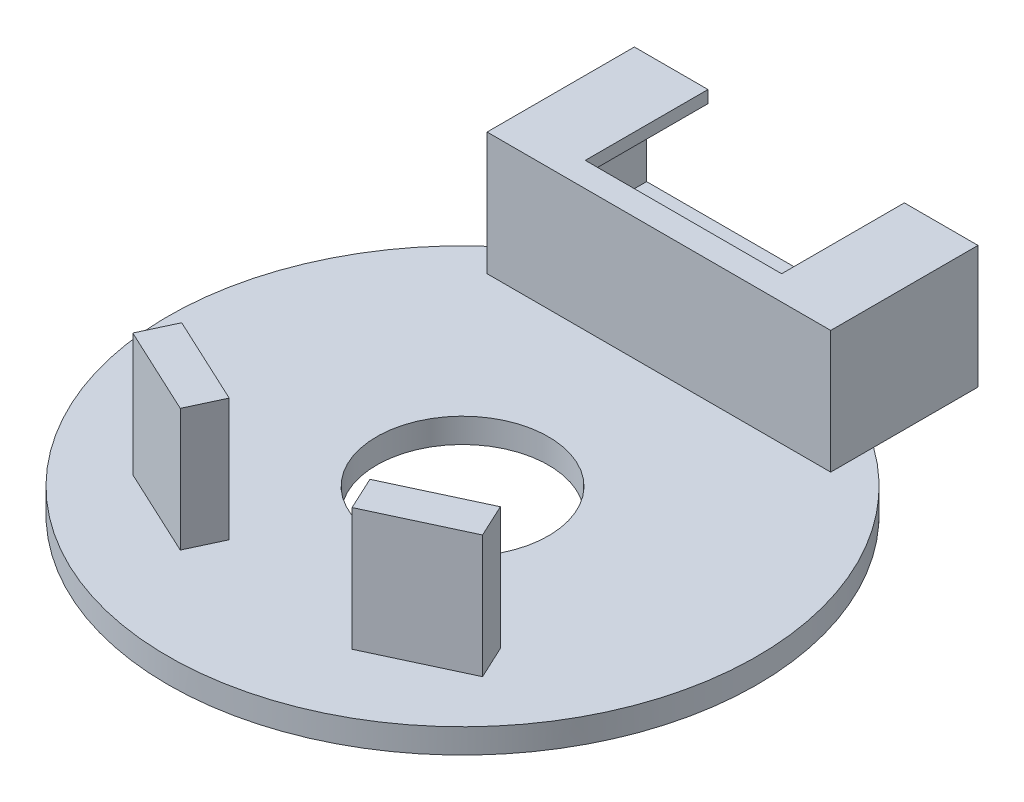
ISO-10303-21;
HEADER;
FILE_DESCRIPTION(('STEP AP214'),'2;1');
FILE_NAME('part.step','',(''),(''),'','','');
FILE_SCHEMA(('AUTOMOTIVE_DESIGN { 1 0 10303 214 1 1 1 1 }'));
ENDSEC;
DATA;
#1=APPLICATION_CONTEXT('core data for automotive mechanical design processes');
#2=APPLICATION_PROTOCOL_DEFINITION('international standard','automotive_design',2000,#1);
#3=PRODUCT_CONTEXT('',#1,'mechanical');
#4=PRODUCT('Part','Part','',(#3));
#5=PRODUCT_RELATED_PRODUCT_CATEGORY('part','',(#4));
#6=PRODUCT_DEFINITION_FORMATION('','',#4);
#7=PRODUCT_DEFINITION_CONTEXT('part definition',#1,'design');
#8=PRODUCT_DEFINITION('design','',#6,#7);
#9=PRODUCT_DEFINITION_SHAPE('','',#8);
#10=(LENGTH_UNIT() NAMED_UNIT(*) SI_UNIT(.MILLI.,.METRE.));
#11=(NAMED_UNIT(*) PLANE_ANGLE_UNIT() SI_UNIT($,.RADIAN.));
#12=(NAMED_UNIT(*) SI_UNIT($,.STERADIAN.) SOLID_ANGLE_UNIT());
#13=UNCERTAINTY_MEASURE_WITH_UNIT(LENGTH_MEASURE(1.E-05),#10,'distance_accuracy_value','');
#14=(GEOMETRIC_REPRESENTATION_CONTEXT(3) GLOBAL_UNCERTAINTY_ASSIGNED_CONTEXT((#13)) GLOBAL_UNIT_ASSIGNED_CONTEXT((#10,
#11,#12)) REPRESENTATION_CONTEXT('',''));
#15=CARTESIAN_POINT('',(0.,0.,0.));
#16=DIRECTION('',(0.,0.,1.));
#17=DIRECTION('',(1.,0.,0.));
#18=AXIS2_PLACEMENT_3D('',#15,#16,#17);
#19=CARTESIAN_POINT('',(0.,0.5,0.));
#20=DIRECTION('',(0.,1.,0.));
#21=DIRECTION('',(0.,0.,1.));
#22=AXIS2_PLACEMENT_3D('',#19,#20,#21);
#23=PLANE('',#22);
#24=DIRECTION('',(0.,0.,1.));
#25=VECTOR('',#24,1.);
#26=CARTESIAN_POINT('',(-7.,0.5,-14.));
#27=LINE('',#26,#25);
#28=CARTESIAN_POINT('',(-7.,0.5,-9.74679434480897));
#29=VERTEX_POINT('',#28);
#30=CARTESIAN_POINT('',(-7.,0.5,-8.));
#31=VERTEX_POINT('',#30);
#32=EDGE_CURVE('E12',#29,#31,#27,.T.);
#33=ORIENTED_EDGE('',*,*,#32,.F.);
#34=CARTESIAN_POINT('',(0.,0.5,0.));
#35=DIRECTION('',(0.,1.,0.));
#36=DIRECTION('',(0.,0.,1.));
#37=AXIS2_PLACEMENT_3D('',#34,#35,#36);
#38=CIRCLE('',#37,12.);
#39=CARTESIAN_POINT('',(7.,0.5,-9.74679434480897));
#40=VERTEX_POINT('',#39);
#41=EDGE_CURVE('E344',#29,#40,#38,.T.);
#42=ORIENTED_EDGE('',*,*,#41,.T.);
#43=DIRECTION('',(0.,0.,-1.));
#44=VECTOR('',#43,1.);
#45=CARTESIAN_POINT('',(7.,0.5,-14.));
#46=LINE('',#45,#44);
#47=CARTESIAN_POINT('',(7.,0.5,-8.));
#48=VERTEX_POINT('',#47);
#49=EDGE_CURVE('E323',#48,#40,#46,.T.);
#50=ORIENTED_EDGE('',*,*,#49,.F.);
#51=DIRECTION('',(1.,0.,0.));
#52=VECTOR('',#51,1.);
#53=CARTESIAN_POINT('',(-7.,0.5,-8.));
#54=LINE('',#53,#52);
#55=EDGE_CURVE('E319',#31,#48,#54,.T.);
#56=ORIENTED_EDGE('',*,*,#55,.F.);
#57=EDGE_LOOP('',(#33,#42,#50,#56));
#58=FACE_BOUND('',#57,.T.);
#59=CARTESIAN_POINT('',(0.,0.5,0.));
#60=DIRECTION('',(0.,1.,0.));
#61=DIRECTION('',(0.,0.,1.));
#62=AXIS2_PLACEMENT_3D('',#59,#60,#61);
#63=CIRCLE('',#62,3.5);
#64=CARTESIAN_POINT('',(0.,0.5,3.5));
#65=VERTEX_POINT('',#64);
#66=EDGE_CURVE('E339',#65,#65,#63,.T.);
#67=ORIENTED_EDGE('',*,*,#66,.F.);
#68=EDGE_LOOP('',(#67));
#69=FACE_BOUND('',#68,.T.);
#70=DIRECTION('',(0.906307787036653,0.,0.422618261740693));
#71=VECTOR('',#70,1.);
#72=CARTESIAN_POINT('',(-3.5,0.5,8.));
#73=LINE('',#72,#71);
#74=CARTESIAN_POINT('',(-7.12523114814661,0.5,6.30952695303723));
#75=VERTEX_POINT('',#74);
#76=CARTESIAN_POINT('',(-3.5,0.5,8.));
#77=VERTEX_POINT('',#76);
#78=EDGE_CURVE('E230',#75,#77,#73,.T.);
#79=ORIENTED_EDGE('',*,*,#78,.F.);
#80=DIRECTION('',(-0.422618261740693,0.,0.906307787036653));
#81=VECTOR('',#80,1.);
#82=CARTESIAN_POINT('',(-7.12523114814661,0.5,6.30952695303723));
#83=LINE('',#82,#81);
#84=CARTESIAN_POINT('',(-6.49130375553557,0.5,4.95006527248225));
#85=VERTEX_POINT('',#84);
#86=EDGE_CURVE('E209',#85,#75,#83,.T.);
#87=ORIENTED_EDGE('',*,*,#86,.F.);
#88=DIRECTION('',(-0.906307787036653,0.,-0.422618261740693));
#89=VECTOR('',#88,1.);
#90=CARTESIAN_POINT('',(-6.49130375553557,0.5,4.95006527248225));
#91=LINE('',#90,#89);
#92=CARTESIAN_POINT('',(-2.86607260738896,0.5,6.64053831944502));
#93=VERTEX_POINT('',#92);
#94=EDGE_CURVE('E223',#93,#85,#91,.T.);
#95=ORIENTED_EDGE('',*,*,#94,.F.);
#96=DIRECTION('',(0.422618261740693,0.,-0.906307787036653));
#97=VECTOR('',#96,1.);
#98=CARTESIAN_POINT('',(-2.86607260738896,0.5,6.64053831944502));
#99=LINE('',#98,#97);
#100=EDGE_CURVE('E67',#77,#93,#99,.T.);
#101=ORIENTED_EDGE('',*,*,#100,.F.);
#102=EDGE_LOOP('',(#79,#87,#95,#101));
#103=FACE_BOUND('',#102,.T.);
#104=DIRECTION('',(-0.422618261740693,0.,-0.906307787036653));
#105=VECTOR('',#104,1.);
#106=CARTESIAN_POINT('',(7.12523114814661,0.5,6.30952695303723));
#107=LINE('',#106,#105);
#108=CARTESIAN_POINT('',(7.12523114814661,0.5,6.30952695303723));
#109=VERTEX_POINT('',#108);
#110=CARTESIAN_POINT('',(6.49130375553557,0.5,4.95006527248225));
#111=VERTEX_POINT('',#110);
#112=EDGE_CURVE('E219',#109,#111,#107,.T.);
#113=ORIENTED_EDGE('',*,*,#112,.F.);
#114=DIRECTION('',(0.906307787036653,0.,-0.422618261740693));
#115=VECTOR('',#114,1.);
#116=CARTESIAN_POINT('',(3.5,0.5,8.));
#117=LINE('',#116,#115);
#118=CARTESIAN_POINT('',(3.5,0.5,8.));
#119=VERTEX_POINT('',#118);
#120=EDGE_CURVE('E213',#119,#109,#117,.T.);
#121=ORIENTED_EDGE('',*,*,#120,.F.);
#122=DIRECTION('',(0.422618261740693,0.,0.906307787036653));
#123=VECTOR('',#122,1.);
#124=CARTESIAN_POINT('',(2.86607260738896,0.5,6.64053831944502));
#125=LINE('',#124,#123);
#126=CARTESIAN_POINT('',(2.86607260738896,0.5,6.64053831944502));
#127=VERTEX_POINT('',#126);
#128=EDGE_CURVE('E193',#127,#119,#125,.T.);
#129=ORIENTED_EDGE('',*,*,#128,.F.);
#130=DIRECTION('',(-0.906307787036653,0.,0.422618261740693));
#131=VECTOR('',#130,1.);
#132=CARTESIAN_POINT('',(6.49130375553557,0.5,4.95006527248225));
#133=LINE('',#132,#131);
#134=EDGE_CURVE('E59',#111,#127,#133,.T.);
#135=ORIENTED_EDGE('',*,*,#134,.F.);
#136=EDGE_LOOP('',(#113,#121,#129,#135));
#137=FACE_BOUND('',#136,.T.);
#138=ADVANCED_FACE('F41',(#58,#69,#103,#137),#23,.T.);
#139=CARTESIAN_POINT('',(6.5,5.,5.60147050873545));
#140=DIRECTION('',(0.,1.,0.));
#141=DIRECTION('',(0.,0.,1.));
#142=AXIS2_PLACEMENT_3D('',#139,#140,#141);
#143=PLANE('',#142);
#144=DIRECTION('',(-1.,0.,0.));
#145=VECTOR('',#144,1.);
#146=CARTESIAN_POINT('',(6.5,5.,-9.));
#147=LINE('',#146,#145);
#148=CARTESIAN_POINT('',(6.5,5.,-9.));
#149=VERTEX_POINT('',#148);
#150=CARTESIAN_POINT('',(4.,5.,-9.));
#151=VERTEX_POINT('',#150);
#152=EDGE_CURVE('E278',#149,#151,#147,.T.);
#153=ORIENTED_EDGE('',*,*,#152,.T.);
#154=DIRECTION('',(0.,0.,-1.));
#155=VECTOR('',#154,1.);
#156=CARTESIAN_POINT('',(4.,5.,5.60147050873545));
#157=LINE('',#156,#155);
#158=CARTESIAN_POINT('',(4.,5.,-14.));
#159=VERTEX_POINT('',#158);
#160=EDGE_CURVE('E270',#151,#159,#157,.T.);
#161=ORIENTED_EDGE('',*,*,#160,.T.);
#162=DIRECTION('',(1.,0.,0.));
#163=VECTOR('',#162,1.);
#164=CARTESIAN_POINT('',(6.5,5.,-14.));
#165=LINE('',#164,#163);
#166=CARTESIAN_POINT('',(6.5,5.,-14.));
#167=VERTEX_POINT('',#166);
#168=EDGE_CURVE('E290',#159,#167,#165,.T.);
#169=ORIENTED_EDGE('',*,*,#168,.T.);
#170=DIRECTION('',(0.,0.,-1.));
#171=VECTOR('',#170,1.);
#172=CARTESIAN_POINT('',(6.5,5.,5.60147050873545));
#173=LINE('',#172,#171);
#174=EDGE_CURVE('E277',#149,#167,#173,.T.);
#175=ORIENTED_EDGE('',*,*,#174,.F.);
#176=EDGE_LOOP('',(#153,#161,#169,#175));
#177=FACE_BOUND('',#176,.T.);
#178=ADVANCED_FACE('F358',(#177),#143,.F.);
#179=CARTESIAN_POINT('',(0.,-0.5,0.));
#180=DIRECTION('',(0.,1.,0.));
#181=DIRECTION('',(0.,0.,1.));
#182=AXIS2_PLACEMENT_3D('',#179,#180,#181);
#183=PLANE('',#182);
#184=CARTESIAN_POINT('',(0.,-0.5,0.));
#185=DIRECTION('',(0.,1.,0.));
#186=DIRECTION('',(0.,0.,1.));
#187=AXIS2_PLACEMENT_3D('',#184,#185,#186);
#188=CIRCLE('',#187,12.);
#189=CARTESIAN_POINT('',(0.,-0.5,12.));
#190=VERTEX_POINT('',#189);
#191=EDGE_CURVE('E45',#190,#190,#188,.T.);
#192=ORIENTED_EDGE('',*,*,#191,.F.);
#193=EDGE_LOOP('',(#192));
#194=FACE_BOUND('',#193,.T.);
#195=CARTESIAN_POINT('',(0.,-0.5,0.));
#196=DIRECTION('',(0.,1.,0.));
#197=DIRECTION('',(0.,0.,1.));
#198=AXIS2_PLACEMENT_3D('',#195,#196,#197);
#199=CIRCLE('',#198,3.5);
#200=CARTESIAN_POINT('',(0.,-0.5,3.5));
#201=VERTEX_POINT('',#200);
#202=EDGE_CURVE('E338',#201,#201,#199,.T.);
#203=ORIENTED_EDGE('',*,*,#202,.T.);
#204=EDGE_LOOP('',(#203));
#205=FACE_BOUND('',#204,.T.);
#206=ADVANCED_FACE('F355',(#194,#205),#183,.F.);
#207=CARTESIAN_POINT('',(0.,0.5,0.));
#208=DIRECTION('',(0.,-1.,0.));
#209=DIRECTION('',(0.,0.,-1.));
#210=AXIS2_PLACEMENT_3D('',#207,#208,#209);
#211=CYLINDRICAL_SURFACE('',#210,12.);
#212=EDGE_CURVE('E50',#40,#29,#38,.T.);
#213=ORIENTED_EDGE('',*,*,#212,.F.);
#214=ORIENTED_EDGE('',*,*,#41,.F.);
#215=EDGE_LOOP('',(#213,#214));
#216=FACE_BOUND('',#215,.T.);
#217=ORIENTED_EDGE('',*,*,#191,.T.);
#218=EDGE_LOOP('',(#217));
#219=FACE_BOUND('',#218,.T.);
#220=ADVANCED_FACE('F43',(#216,#219),#211,.T.);
#221=CARTESIAN_POINT('',(0.,0.5,0.));
#222=DIRECTION('',(0.,-1.,0.));
#223=DIRECTION('',(0.,0.,-1.));
#224=AXIS2_PLACEMENT_3D('',#221,#222,#223);
#225=CYLINDRICAL_SURFACE('',#224,3.5);
#226=ORIENTED_EDGE('',*,*,#66,.T.);
#227=EDGE_LOOP('',(#226));
#228=FACE_BOUND('',#227,.T.);
#229=ORIENTED_EDGE('',*,*,#202,.F.);
#230=EDGE_LOOP('',(#229));
#231=FACE_BOUND('',#230,.T.);
#232=ADVANCED_FACE('F361',(#228,#231),#225,.F.);
#233=CARTESIAN_POINT('',(0.,0.5,0.));
#234=DIRECTION('',(0.,1.,0.));
#235=DIRECTION('',(0.,0.,1.));
#236=AXIS2_PLACEMENT_3D('',#233,#234,#235);
#237=PLANE('',#236);
#238=CARTESIAN_POINT('',(7.,0.5,-14.));
#239=VERTEX_POINT('',#238);
#240=EDGE_CURVE('E322',#40,#239,#46,.T.);
#241=ORIENTED_EDGE('',*,*,#240,.F.);
#242=ORIENTED_EDGE('',*,*,#212,.T.);
#243=CARTESIAN_POINT('',(-7.,0.5,-14.));
#244=VERTEX_POINT('',#243);
#245=EDGE_CURVE('E52',#244,#29,#27,.T.);
#246=ORIENTED_EDGE('',*,*,#245,.F.);
#247=DIRECTION('',(-1.,0.,0.));
#248=VECTOR('',#247,1.);
#249=CARTESIAN_POINT('',(-7.,0.5,-14.));
#250=LINE('',#249,#248);
#251=EDGE_CURVE('E309',#239,#244,#250,.T.);
#252=ORIENTED_EDGE('',*,*,#251,.F.);
#253=EDGE_LOOP('',(#241,#242,#246,#252));
#254=FACE_BOUND('',#253,.T.);
#255=ADVANCED_FACE('F363',(#254),#237,.F.);
#256=CARTESIAN_POINT('',(-7.,5.5,-14.));
#257=DIRECTION('',(1.,0.,0.));
#258=DIRECTION('',(0.,0.,-1.));
#259=AXIS2_PLACEMENT_3D('',#256,#257,#258);
#260=PLANE('',#259);
#261=ORIENTED_EDGE('',*,*,#245,.T.);
#262=ORIENTED_EDGE('',*,*,#32,.T.);
#263=DIRECTION('',(0.,-1.,0.));
#264=VECTOR('',#263,1.);
#265=CARTESIAN_POINT('',(-7.,5.5,-8.));
#266=LINE('',#265,#264);
#267=CARTESIAN_POINT('',(-7.,5.5,-8.));
#268=VERTEX_POINT('',#267);
#269=EDGE_CURVE('E335',#268,#31,#266,.T.);
#270=ORIENTED_EDGE('',*,*,#269,.F.);
#271=DIRECTION('',(0.,0.,1.));
#272=VECTOR('',#271,1.);
#273=CARTESIAN_POINT('',(-7.,5.5,-14.));
#274=LINE('',#273,#272);
#275=CARTESIAN_POINT('',(-7.,5.5,-14.));
#276=VERTEX_POINT('',#275);
#277=EDGE_CURVE('E305',#276,#268,#274,.T.);
#278=ORIENTED_EDGE('',*,*,#277,.F.);
#279=DIRECTION('',(0.,-1.,0.));
#280=VECTOR('',#279,1.);
#281=CARTESIAN_POINT('',(-7.,5.5,-14.));
#282=LINE('',#281,#280);
#283=EDGE_CURVE('E316',#276,#244,#282,.T.);
#284=ORIENTED_EDGE('',*,*,#283,.T.);
#285=EDGE_LOOP('',(#261,#262,#270,#278,#284));
#286=FACE_BOUND('',#285,.T.);
#287=ADVANCED_FACE('F370',(#286),#260,.F.);
#288=CARTESIAN_POINT('',(-7.,5.5,-8.));
#289=DIRECTION('',(0.,0.,-1.));
#290=DIRECTION('',(-1.,0.,0.));
#291=AXIS2_PLACEMENT_3D('',#288,#289,#290);
#292=PLANE('',#291);
#293=ORIENTED_EDGE('',*,*,#55,.T.);
#294=DIRECTION('',(0.,-1.,0.));
#295=VECTOR('',#294,1.);
#296=CARTESIAN_POINT('',(7.,5.5,-8.));
#297=LINE('',#296,#295);
#298=CARTESIAN_POINT('',(7.,5.5,-8.));
#299=VERTEX_POINT('',#298);
#300=EDGE_CURVE('E332',#299,#48,#297,.T.);
#301=ORIENTED_EDGE('',*,*,#300,.F.);
#302=DIRECTION('',(1.,0.,0.));
#303=VECTOR('',#302,1.);
#304=CARTESIAN_POINT('',(-7.,5.5,-8.));
#305=LINE('',#304,#303);
#306=EDGE_CURVE('E308',#268,#299,#305,.T.);
#307=ORIENTED_EDGE('',*,*,#306,.F.);
#308=ORIENTED_EDGE('',*,*,#269,.T.);
#309=EDGE_LOOP('',(#293,#301,#307,#308));
#310=FACE_BOUND('',#309,.T.);
#311=ADVANCED_FACE('F465',(#310),#292,.F.);
#312=CARTESIAN_POINT('',(7.,5.5,-14.));
#313=DIRECTION('',(-1.,0.,0.));
#314=DIRECTION('',(0.,0.,1.));
#315=AXIS2_PLACEMENT_3D('',#312,#313,#314);
#316=PLANE('',#315);
#317=ORIENTED_EDGE('',*,*,#49,.T.);
#318=ORIENTED_EDGE('',*,*,#240,.T.);
#319=DIRECTION('',(0.,-1.,0.));
#320=VECTOR('',#319,1.);
#321=CARTESIAN_POINT('',(7.,5.5,-14.));
#322=LINE('',#321,#320);
#323=CARTESIAN_POINT('',(7.,5.5,-14.));
#324=VERTEX_POINT('',#323);
#325=EDGE_CURVE('E329',#324,#239,#322,.T.);
#326=ORIENTED_EDGE('',*,*,#325,.F.);
#327=DIRECTION('',(0.,0.,-1.));
#328=VECTOR('',#327,1.);
#329=CARTESIAN_POINT('',(7.,5.5,-14.));
#330=LINE('',#329,#328);
#331=EDGE_CURVE('E311',#299,#324,#330,.T.);
#332=ORIENTED_EDGE('',*,*,#331,.F.);
#333=ORIENTED_EDGE('',*,*,#300,.T.);
#334=EDGE_LOOP('',(#317,#318,#326,#332,#333));
#335=FACE_BOUND('',#334,.T.);
#336=ADVANCED_FACE('F461',(#335),#316,.F.);
#337=CARTESIAN_POINT('',(-7.,5.5,-14.));
#338=DIRECTION('',(0.,0.,1.));
#339=DIRECTION('',(1.,0.,0.));
#340=AXIS2_PLACEMENT_3D('',#337,#338,#339);
#341=PLANE('',#340);
#342=ORIENTED_EDGE('',*,*,#168,.F.);
#343=DIRECTION('',(0.,1.,0.));
#344=VECTOR('',#343,1.);
#345=CARTESIAN_POINT('',(4.,-8.4339811320566,-14.));
#346=LINE('',#345,#344);
#347=CARTESIAN_POINT('',(4.,5.5,-14.));
#348=VERTEX_POINT('',#347);
#349=EDGE_CURVE('E262',#159,#348,#346,.T.);
#350=ORIENTED_EDGE('',*,*,#349,.T.);
#351=DIRECTION('',(-1.,0.,0.));
#352=VECTOR('',#351,1.);
#353=CARTESIAN_POINT('',(-7.,5.5,-14.));
#354=LINE('',#353,#352);
#355=EDGE_CURVE('E314',#324,#348,#354,.T.);
#356=ORIENTED_EDGE('',*,*,#355,.F.);
#357=ORIENTED_EDGE('',*,*,#325,.T.);
#358=ORIENTED_EDGE('',*,*,#251,.T.);
#359=ORIENTED_EDGE('',*,*,#283,.F.);
#360=CARTESIAN_POINT('',(-4.,5.5,-14.));
#361=VERTEX_POINT('',#360);
#362=EDGE_CURVE('E313',#361,#276,#354,.T.);
#363=ORIENTED_EDGE('',*,*,#362,.F.);
#364=DIRECTION('',(0.,1.,0.));
#365=VECTOR('',#364,1.);
#366=CARTESIAN_POINT('',(-4.,-8.4339811320566,-14.));
#367=LINE('',#366,#365);
#368=CARTESIAN_POINT('',(-4.,5.,-14.));
#369=VERTEX_POINT('',#368);
#370=EDGE_CURVE('E259',#369,#361,#367,.T.);
#371=ORIENTED_EDGE('',*,*,#370,.F.);
#372=CARTESIAN_POINT('',(-6.5,5.,-14.));
#373=VERTEX_POINT('',#372);
#374=EDGE_CURVE('E291',#373,#369,#165,.T.);
#375=ORIENTED_EDGE('',*,*,#374,.F.);
#376=DIRECTION('',(0.,1.,0.));
#377=VECTOR('',#376,1.);
#378=CARTESIAN_POINT('',(-6.5,5.,-14.));
#379=LINE('',#378,#377);
#380=CARTESIAN_POINT('',(-6.5,1.,-14.));
#381=VERTEX_POINT('',#380);
#382=EDGE_CURVE('E287',#381,#373,#379,.T.);
#383=ORIENTED_EDGE('',*,*,#382,.F.);
#384=DIRECTION('',(-1.,0.,0.));
#385=VECTOR('',#384,1.);
#386=CARTESIAN_POINT('',(6.5,1.,-14.));
#387=LINE('',#386,#385);
#388=CARTESIAN_POINT('',(6.5,1.,-14.));
#389=VERTEX_POINT('',#388);
#390=EDGE_CURVE('E285',#389,#381,#387,.T.);
#391=ORIENTED_EDGE('',*,*,#390,.F.);
#392=DIRECTION('',(0.,-1.,0.));
#393=VECTOR('',#392,1.);
#394=CARTESIAN_POINT('',(6.5,5.,-14.));
#395=LINE('',#394,#393);
#396=EDGE_CURVE('E273',#167,#389,#395,.T.);
#397=ORIENTED_EDGE('',*,*,#396,.F.);
#398=EDGE_LOOP('',(#342,#350,#356,#357,#358,#359,#363,#371,#375,#383,#391,#397));
#399=FACE_BOUND('',#398,.T.);
#400=ADVANCED_FACE('F456',(#399),#341,.F.);
#401=CARTESIAN_POINT('',(0.,5.5,0.));
#402=DIRECTION('',(0.,1.,0.));
#403=DIRECTION('',(0.,0.,1.));
#404=AXIS2_PLACEMENT_3D('',#401,#402,#403);
#405=PLANE('',#404);
#406=DIRECTION('',(0.,0.,-1.));
#407=VECTOR('',#406,1.);
#408=CARTESIAN_POINT('',(4.,5.5,-14.));
#409=LINE('',#408,#407);
#410=CARTESIAN_POINT('',(4.,5.5,-9.));
#411=VERTEX_POINT('',#410);
#412=EDGE_CURVE('E251',#411,#348,#409,.T.);
#413=ORIENTED_EDGE('',*,*,#412,.F.);
#414=DIRECTION('',(1.,0.,0.));
#415=VECTOR('',#414,1.);
#416=CARTESIAN_POINT('',(-4.,5.5,-9.));
#417=LINE('',#416,#415);
#418=CARTESIAN_POINT('',(-4.,5.5,-9.));
#419=VERTEX_POINT('',#418);
#420=EDGE_CURVE('E254',#419,#411,#417,.T.);
#421=ORIENTED_EDGE('',*,*,#420,.F.);
#422=DIRECTION('',(0.,0.,1.));
#423=VECTOR('',#422,1.);
#424=CARTESIAN_POINT('',(-4.,5.5,-14.));
#425=LINE('',#424,#423);
#426=EDGE_CURVE('E239',#361,#419,#425,.T.);
#427=ORIENTED_EDGE('',*,*,#426,.F.);
#428=ORIENTED_EDGE('',*,*,#362,.T.);
#429=ORIENTED_EDGE('',*,*,#277,.T.);
#430=ORIENTED_EDGE('',*,*,#306,.T.);
#431=ORIENTED_EDGE('',*,*,#331,.T.);
#432=ORIENTED_EDGE('',*,*,#355,.T.);
#433=EDGE_LOOP('',(#413,#421,#427,#428,#429,#430,#431,#432));
#434=FACE_BOUND('',#433,.T.);
#435=ADVANCED_FACE('F453',(#434),#405,.T.);
#436=CARTESIAN_POINT('',(6.5,5.,5.60147050873545));
#437=DIRECTION('',(1.,0.,0.));
#438=DIRECTION('',(0.,1.,0.));
#439=AXIS2_PLACEMENT_3D('',#436,#437,#438);
#440=PLANE('',#439);
#441=DIRECTION('',(0.,1.,0.));
#442=VECTOR('',#441,1.);
#443=CARTESIAN_POINT('',(6.5,5.,-9.));
#444=LINE('',#443,#442);
#445=CARTESIAN_POINT('',(6.5,1.,-9.));
#446=VERTEX_POINT('',#445);
#447=EDGE_CURVE('E281',#446,#149,#444,.T.);
#448=ORIENTED_EDGE('',*,*,#447,.T.);
#449=ORIENTED_EDGE('',*,*,#174,.T.);
#450=ORIENTED_EDGE('',*,*,#396,.T.);
#451=DIRECTION('',(0.,0.,-1.));
#452=VECTOR('',#451,1.);
#453=CARTESIAN_POINT('',(6.5,1.,5.60147050873545));
#454=LINE('',#453,#452);
#455=EDGE_CURVE('E294',#446,#389,#454,.T.);
#456=ORIENTED_EDGE('',*,*,#455,.F.);
#457=EDGE_LOOP('',(#448,#449,#450,#456));
#458=FACE_BOUND('',#457,.T.);
#459=ADVANCED_FACE('F443',(#458),#440,.F.);
#460=ORIENTED_EDGE('',*,*,#374,.T.);
#461=DIRECTION('',(0.,0.,1.));
#462=VECTOR('',#461,1.);
#463=CARTESIAN_POINT('',(-4.,5.,5.60147050873545));
#464=LINE('',#463,#462);
#465=CARTESIAN_POINT('',(-4.,5.,-9.));
#466=VERTEX_POINT('',#465);
#467=EDGE_CURVE('E267',#369,#466,#464,.T.);
#468=ORIENTED_EDGE('',*,*,#467,.T.);
#469=CARTESIAN_POINT('',(-6.5,5.,-9.));
#470=VERTEX_POINT('',#469);
#471=EDGE_CURVE('E276',#466,#470,#147,.T.);
#472=ORIENTED_EDGE('',*,*,#471,.T.);
#473=DIRECTION('',(0.,0.,-1.));
#474=VECTOR('',#473,1.);
#475=CARTESIAN_POINT('',(-6.5,5.,5.60147050873545));
#476=LINE('',#475,#474);
#477=EDGE_CURVE('E297',#470,#373,#476,.T.);
#478=ORIENTED_EDGE('',*,*,#477,.T.);
#479=EDGE_LOOP('',(#460,#468,#472,#478));
#480=FACE_BOUND('',#479,.T.);
#481=ADVANCED_FACE('F381',(#480),#143,.F.);
#482=CARTESIAN_POINT('',(-6.5,5.,5.60147050873545));
#483=DIRECTION('',(-1.,0.,0.));
#484=DIRECTION('',(0.,-1.,0.));
#485=AXIS2_PLACEMENT_3D('',#482,#483,#484);
#486=PLANE('',#485);
#487=DIRECTION('',(0.,-1.,0.));
#488=VECTOR('',#487,1.);
#489=CARTESIAN_POINT('',(-6.5,5.,-9.));
#490=LINE('',#489,#488);
#491=CARTESIAN_POINT('',(-6.5,1.,-9.));
#492=VERTEX_POINT('',#491);
#493=EDGE_CURVE('E274',#470,#492,#490,.T.);
#494=ORIENTED_EDGE('',*,*,#493,.T.);
#495=DIRECTION('',(0.,0.,-1.));
#496=VECTOR('',#495,1.);
#497=CARTESIAN_POINT('',(-6.5,1.,5.60147050873545));
#498=LINE('',#497,#496);
#499=EDGE_CURVE('E299',#492,#381,#498,.T.);
#500=ORIENTED_EDGE('',*,*,#499,.T.);
#501=ORIENTED_EDGE('',*,*,#382,.T.);
#502=ORIENTED_EDGE('',*,*,#477,.F.);
#503=EDGE_LOOP('',(#494,#500,#501,#502));
#504=FACE_BOUND('',#503,.T.);
#505=ADVANCED_FACE('F442',(#504),#486,.F.);
#506=CARTESIAN_POINT('',(6.5,1.,5.60147050873545));
#507=DIRECTION('',(0.,-1.,0.));
#508=DIRECTION('',(0.,0.,-1.));
#509=AXIS2_PLACEMENT_3D('',#506,#507,#508);
#510=PLANE('',#509);
#511=DIRECTION('',(1.,0.,0.));
#512=VECTOR('',#511,1.);
#513=CARTESIAN_POINT('',(6.5,1.,-9.));
#514=LINE('',#513,#512);
#515=EDGE_CURVE('E283',#492,#446,#514,.T.);
#516=ORIENTED_EDGE('',*,*,#515,.T.);
#517=ORIENTED_EDGE('',*,*,#455,.T.);
#518=ORIENTED_EDGE('',*,*,#390,.T.);
#519=ORIENTED_EDGE('',*,*,#499,.F.);
#520=EDGE_LOOP('',(#516,#517,#518,#519));
#521=FACE_BOUND('',#520,.T.);
#522=ADVANCED_FACE('F438',(#521),#510,.F.);
#523=CARTESIAN_POINT('',(-7.,5.5,-9.));
#524=DIRECTION('',(0.,0.,-1.));
#525=DIRECTION('',(-1.,0.,0.));
#526=AXIS2_PLACEMENT_3D('',#523,#524,#525);
#527=PLANE('',#526);
#528=ORIENTED_EDGE('',*,*,#471,.F.);
#529=DIRECTION('',(0.,1.,0.));
#530=VECTOR('',#529,1.);
#531=CARTESIAN_POINT('',(-4.,-8.4339811320566,-9.));
#532=LINE('',#531,#530);
#533=EDGE_CURVE('E261',#466,#419,#532,.T.);
#534=ORIENTED_EDGE('',*,*,#533,.T.);
#535=ORIENTED_EDGE('',*,*,#420,.T.);
#536=DIRECTION('',(0.,1.,0.));
#537=VECTOR('',#536,1.);
#538=CARTESIAN_POINT('',(4.,-8.4339811320566,-9.));
#539=LINE('',#538,#537);
#540=EDGE_CURVE('E253',#151,#411,#539,.T.);
#541=ORIENTED_EDGE('',*,*,#540,.F.);
#542=ORIENTED_EDGE('',*,*,#152,.F.);
#543=ORIENTED_EDGE('',*,*,#447,.F.);
#544=ORIENTED_EDGE('',*,*,#515,.F.);
#545=ORIENTED_EDGE('',*,*,#493,.F.);
#546=EDGE_LOOP('',(#528,#534,#535,#541,#542,#543,#544,#545));
#547=FACE_BOUND('',#546,.T.);
#548=ADVANCED_FACE('F435',(#547),#527,.T.);
#549=CARTESIAN_POINT('',(4.,-8.4339811320566,-14.));
#550=DIRECTION('',(1.,0.,0.));
#551=DIRECTION('',(0.,0.,-1.));
#552=AXIS2_PLACEMENT_3D('',#549,#550,#551);
#553=PLANE('',#552);
#554=ORIENTED_EDGE('',*,*,#540,.T.);
#555=ORIENTED_EDGE('',*,*,#412,.T.);
#556=ORIENTED_EDGE('',*,*,#349,.F.);
#557=ORIENTED_EDGE('',*,*,#160,.F.);
#558=EDGE_LOOP('',(#554,#555,#556,#557));
#559=FACE_BOUND('',#558,.T.);
#560=ADVANCED_FACE('F431',(#559),#553,.F.);
#561=CARTESIAN_POINT('',(-4.,-8.4339811320566,-14.));
#562=DIRECTION('',(-1.,0.,0.));
#563=DIRECTION('',(0.,0.,1.));
#564=AXIS2_PLACEMENT_3D('',#561,#562,#563);
#565=PLANE('',#564);
#566=ORIENTED_EDGE('',*,*,#370,.T.);
#567=ORIENTED_EDGE('',*,*,#426,.T.);
#568=ORIENTED_EDGE('',*,*,#533,.F.);
#569=ORIENTED_EDGE('',*,*,#467,.F.);
#570=EDGE_LOOP('',(#566,#567,#568,#569));
#571=FACE_BOUND('',#570,.T.);
#572=ADVANCED_FACE('F426',(#571),#565,.F.);
#573=CARTESIAN_POINT('',(-7.12523114814661,10.7385621421749,6.30952695303723));
#574=DIRECTION('',(0.906307787036653,0.,0.422618261740693));
#575=DIRECTION('',(0.422618261740693,0.,-0.906307787036653));
#576=AXIS2_PLACEMENT_3D('',#573,#574,#575);
#577=PLANE('',#576);
#578=DIRECTION('',(-0.422618261740693,0.,0.906307787036653));
#579=VECTOR('',#578,1.);
#580=CARTESIAN_POINT('',(-7.12523114814661,5.5,6.30952695303723));
#581=LINE('',#580,#579);
#582=CARTESIAN_POINT('',(-6.49130375553557,5.5,4.95006527248225));
#583=VERTEX_POINT('',#582);
#584=CARTESIAN_POINT('',(-7.12523114814661,5.5,6.30952695303723));
#585=VERTEX_POINT('',#584);
#586=EDGE_CURVE('E243',#583,#585,#581,.T.);
#587=ORIENTED_EDGE('',*,*,#586,.F.);
#588=DIRECTION('',(0.,-1.,0.));
#589=VECTOR('',#588,1.);
#590=CARTESIAN_POINT('',(-6.49130375553557,10.7385621421749,4.95006527248225));
#591=LINE('',#590,#589);
#592=EDGE_CURVE('E207',#583,#85,#591,.T.);
#593=ORIENTED_EDGE('',*,*,#592,.T.);
#594=ORIENTED_EDGE('',*,*,#86,.T.);
#595=DIRECTION('',(0.,-1.,0.));
#596=VECTOR('',#595,1.);
#597=CARTESIAN_POINT('',(-7.12523114814661,10.7385621421749,6.30952695303723));
#598=LINE('',#597,#596);
#599=EDGE_CURVE('E233',#585,#75,#598,.T.);
#600=ORIENTED_EDGE('',*,*,#599,.F.);
#601=EDGE_LOOP('',(#587,#593,#594,#600));
#602=FACE_BOUND('',#601,.T.);
#603=ADVANCED_FACE('F423',(#602),#577,.F.);
#604=CARTESIAN_POINT('',(-3.5,10.7385621421749,8.));
#605=DIRECTION('',(0.422618261740693,0.,-0.906307787036653));
#606=DIRECTION('',(-0.906307787036653,0.,-0.422618261740694));
#607=AXIS2_PLACEMENT_3D('',#604,#605,#606);
#608=PLANE('',#607);
#609=DIRECTION('',(0.906307787036653,0.,0.422618261740694));
#610=VECTOR('',#609,1.);
#611=CARTESIAN_POINT('',(-3.5,5.5,8.));
#612=LINE('',#611,#610);
#613=CARTESIAN_POINT('',(-3.5,5.5,8.));
#614=VERTEX_POINT('',#613);
#615=EDGE_CURVE('E240',#585,#614,#612,.T.);
#616=ORIENTED_EDGE('',*,*,#615,.F.);
#617=ORIENTED_EDGE('',*,*,#599,.T.);
#618=ORIENTED_EDGE('',*,*,#78,.T.);
#619=DIRECTION('',(0.,-1.,0.));
#620=VECTOR('',#619,1.);
#621=CARTESIAN_POINT('',(-3.5,10.7385621421749,8.));
#622=LINE('',#621,#620);
#623=EDGE_CURVE('E229',#614,#77,#622,.T.);
#624=ORIENTED_EDGE('',*,*,#623,.F.);
#625=EDGE_LOOP('',(#616,#617,#618,#624));
#626=FACE_BOUND('',#625,.T.);
#627=ADVANCED_FACE('F420',(#626),#608,.F.);
#628=CARTESIAN_POINT('',(-2.86607260738896,10.7385621421749,6.64053831944502));
#629=DIRECTION('',(-0.906307787036653,0.,-0.422618261740693));
#630=DIRECTION('',(-0.422618261740694,0.,0.906307787036653));
#631=AXIS2_PLACEMENT_3D('',#628,#629,#630);
#632=PLANE('',#631);
#633=DIRECTION('',(0.422618261740694,0.,-0.906307787036653));
#634=VECTOR('',#633,1.);
#635=CARTESIAN_POINT('',(-2.86607260738896,5.5,6.64053831944502));
#636=LINE('',#635,#634);
#637=CARTESIAN_POINT('',(-2.86607260738896,5.5,6.64053831944502));
#638=VERTEX_POINT('',#637);
#639=EDGE_CURVE('E236',#614,#638,#636,.T.);
#640=ORIENTED_EDGE('',*,*,#639,.F.);
#641=ORIENTED_EDGE('',*,*,#623,.T.);
#642=ORIENTED_EDGE('',*,*,#100,.T.);
#643=DIRECTION('',(0.,-1.,0.));
#644=VECTOR('',#643,1.);
#645=CARTESIAN_POINT('',(-2.86607260738896,10.7385621421749,6.64053831944502));
#646=LINE('',#645,#644);
#647=EDGE_CURVE('E227',#638,#93,#646,.T.);
#648=ORIENTED_EDGE('',*,*,#647,.F.);
#649=EDGE_LOOP('',(#640,#641,#642,#648));
#650=FACE_BOUND('',#649,.T.);
#651=ADVANCED_FACE('F416',(#650),#632,.F.);
#652=CARTESIAN_POINT('',(-6.49130375553557,10.7385621421749,4.95006527248225));
#653=DIRECTION('',(-0.422618261740693,0.,0.906307787036653));
#654=DIRECTION('',(0.906307787036653,0.,0.422618261740693));
#655=AXIS2_PLACEMENT_3D('',#652,#653,#654);
#656=PLANE('',#655);
#657=DIRECTION('',(-0.906307787036653,0.,-0.422618261740693));
#658=VECTOR('',#657,1.);
#659=CARTESIAN_POINT('',(-6.49130375553557,5.5,4.95006527248225));
#660=LINE('',#659,#658);
#661=EDGE_CURVE('E226',#638,#583,#660,.T.);
#662=ORIENTED_EDGE('',*,*,#661,.F.);
#663=ORIENTED_EDGE('',*,*,#647,.T.);
#664=ORIENTED_EDGE('',*,*,#94,.T.);
#665=ORIENTED_EDGE('',*,*,#592,.F.);
#666=EDGE_LOOP('',(#662,#663,#664,#665));
#667=FACE_BOUND('',#666,.T.);
#668=ADVANCED_FACE('F407',(#667),#656,.F.);
#669=CARTESIAN_POINT('',(0.,5.5,0.));
#670=DIRECTION('',(0.,1.,0.));
#671=DIRECTION('',(0.,0.,1.));
#672=AXIS2_PLACEMENT_3D('',#669,#670,#671);
#673=PLANE('',#672);
#674=ORIENTED_EDGE('',*,*,#661,.T.);
#675=ORIENTED_EDGE('',*,*,#586,.T.);
#676=ORIENTED_EDGE('',*,*,#615,.T.);
#677=ORIENTED_EDGE('',*,*,#639,.T.);
#678=EDGE_LOOP('',(#674,#675,#676,#677));
#679=FACE_BOUND('',#678,.T.);
#680=ADVANCED_FACE('F400',(#679),#673,.T.);
#681=CARTESIAN_POINT('',(3.5,10.7385621421749,8.));
#682=DIRECTION('',(-0.422618261740693,0.,-0.906307787036653));
#683=DIRECTION('',(-0.906307787036653,0.,0.422618261740694));
#684=AXIS2_PLACEMENT_3D('',#681,#682,#683);
#685=PLANE('',#684);
#686=DIRECTION('',(0.906307787036653,0.,-0.422618261740694));
#687=VECTOR('',#686,1.);
#688=CARTESIAN_POINT('',(3.5,5.5,8.));
#689=LINE('',#688,#687);
#690=CARTESIAN_POINT('',(3.5,5.5,8.));
#691=VERTEX_POINT('',#690);
#692=CARTESIAN_POINT('',(7.12523114814661,5.5,6.30952695303723));
#693=VERTEX_POINT('',#692);
#694=EDGE_CURVE('E202',#691,#693,#689,.T.);
#695=ORIENTED_EDGE('',*,*,#694,.F.);
#696=DIRECTION('',(0.,-1.,0.));
#697=VECTOR('',#696,1.);
#698=CARTESIAN_POINT('',(3.5,10.7385621421749,8.));
#699=LINE('',#698,#697);
#700=EDGE_CURVE('E198',#691,#119,#699,.T.);
#701=ORIENTED_EDGE('',*,*,#700,.T.);
#702=ORIENTED_EDGE('',*,*,#120,.T.);
#703=DIRECTION('',(0.,-1.,0.));
#704=VECTOR('',#703,1.);
#705=CARTESIAN_POINT('',(7.12523114814661,10.7385621421749,6.30952695303723));
#706=LINE('',#705,#704);
#707=EDGE_CURVE('E217',#693,#109,#706,.T.);
#708=ORIENTED_EDGE('',*,*,#707,.F.);
#709=EDGE_LOOP('',(#695,#701,#702,#708));
#710=FACE_BOUND('',#709,.T.);
#711=ADVANCED_FACE('F398',(#710),#685,.F.);
#712=CARTESIAN_POINT('',(7.12523114814661,10.7385621421749,6.30952695303723));
#713=DIRECTION('',(-0.906307787036653,0.,0.422618261740693));
#714=DIRECTION('',(0.422618261740693,0.,0.906307787036653));
#715=AXIS2_PLACEMENT_3D('',#712,#713,#714);
#716=PLANE('',#715);
#717=DIRECTION('',(-0.422618261740693,0.,-0.906307787036653));
#718=VECTOR('',#717,1.);
#719=CARTESIAN_POINT('',(7.12523114814661,5.5,6.30952695303723));
#720=LINE('',#719,#718);
#721=CARTESIAN_POINT('',(6.49130375553557,5.5,4.95006527248225));
#722=VERTEX_POINT('',#721);
#723=EDGE_CURVE('E206',#693,#722,#720,.T.);
#724=ORIENTED_EDGE('',*,*,#723,.F.);
#725=ORIENTED_EDGE('',*,*,#707,.T.);
#726=ORIENTED_EDGE('',*,*,#112,.T.);
#727=DIRECTION('',(0.,-1.,0.));
#728=VECTOR('',#727,1.);
#729=CARTESIAN_POINT('',(6.49130375553557,10.7385621421749,4.95006527248225));
#730=LINE('',#729,#728);
#731=EDGE_CURVE('E220',#722,#111,#730,.T.);
#732=ORIENTED_EDGE('',*,*,#731,.F.);
#733=EDGE_LOOP('',(#724,#725,#726,#732));
#734=FACE_BOUND('',#733,.T.);
#735=ADVANCED_FACE('F395',(#734),#716,.F.);
#736=CARTESIAN_POINT('',(6.49130375553557,10.7385621421749,4.95006527248225));
#737=DIRECTION('',(0.422618261740693,0.,0.906307787036653));
#738=DIRECTION('',(0.906307787036653,0.,-0.422618261740693));
#739=AXIS2_PLACEMENT_3D('',#736,#737,#738);
#740=PLANE('',#739);
#741=DIRECTION('',(-0.906307787036653,0.,0.422618261740693));
#742=VECTOR('',#741,1.);
#743=CARTESIAN_POINT('',(6.49130375553557,5.5,4.95006527248225));
#744=LINE('',#743,#742);
#745=CARTESIAN_POINT('',(2.86607260738896,5.5,6.64053831944502));
#746=VERTEX_POINT('',#745);
#747=EDGE_CURVE('E188',#722,#746,#744,.T.);
#748=ORIENTED_EDGE('',*,*,#747,.F.);
#749=ORIENTED_EDGE('',*,*,#731,.T.);
#750=ORIENTED_EDGE('',*,*,#134,.T.);
#751=DIRECTION('',(0.,-1.,0.));
#752=VECTOR('',#751,1.);
#753=CARTESIAN_POINT('',(2.86607260738896,10.7385621421749,6.64053831944502));
#754=LINE('',#753,#752);
#755=EDGE_CURVE('E184',#746,#127,#754,.T.);
#756=ORIENTED_EDGE('',*,*,#755,.F.);
#757=EDGE_LOOP('',(#748,#749,#750,#756));
#758=FACE_BOUND('',#757,.T.);
#759=ADVANCED_FACE('F186',(#758),#740,.F.);
#760=CARTESIAN_POINT('',(2.86607260738896,10.7385621421749,6.64053831944502));
#761=DIRECTION('',(0.906307787036653,0.,-0.422618261740693));
#762=DIRECTION('',(-0.422618261740694,0.,-0.906307787036653));
#763=AXIS2_PLACEMENT_3D('',#760,#761,#762);
#764=PLANE('',#763);
#765=DIRECTION('',(0.422618261740694,0.,0.906307787036653));
#766=VECTOR('',#765,1.);
#767=CARTESIAN_POINT('',(2.86607260738896,5.5,6.64053831944502));
#768=LINE('',#767,#766);
#769=EDGE_CURVE('E196',#746,#691,#768,.T.);
#770=ORIENTED_EDGE('',*,*,#769,.F.);
#771=ORIENTED_EDGE('',*,*,#755,.T.);
#772=ORIENTED_EDGE('',*,*,#128,.T.);
#773=ORIENTED_EDGE('',*,*,#700,.F.);
#774=EDGE_LOOP('',(#770,#771,#772,#773));
#775=FACE_BOUND('',#774,.T.);
#776=ADVANCED_FACE('F197',(#775),#764,.F.);
#777=CARTESIAN_POINT('',(0.,5.5,0.));
#778=DIRECTION('',(0.,1.,0.));
#779=DIRECTION('',(0.,0.,1.));
#780=AXIS2_PLACEMENT_3D('',#777,#778,#779);
#781=PLANE('',#780);
#782=ORIENTED_EDGE('',*,*,#769,.T.);
#783=ORIENTED_EDGE('',*,*,#694,.T.);
#784=ORIENTED_EDGE('',*,*,#723,.T.);
#785=ORIENTED_EDGE('',*,*,#747,.T.);
#786=EDGE_LOOP('',(#782,#783,#784,#785));
#787=FACE_BOUND('',#786,.T.);
#788=ADVANCED_FACE('F205',(#787),#781,.T.);
#789=CLOSED_SHELL('',(#138,#178,#206,#220,#232,#255,#287,#311,#336,#400,#435,#459,#481,#505,
#522,#548,#560,#572,#603,#627,#651,#668,#680,#711,#735,#759,#776,#788));
#790=MANIFOLD_SOLID_BREP('B2',#789);
#791=ADVANCED_BREP_SHAPE_REPRESENTATION('',(#18,#790),#14);
#792=SHAPE_DEFINITION_REPRESENTATION(#9,#791);
ENDSEC;
END-ISO-10303-21;
